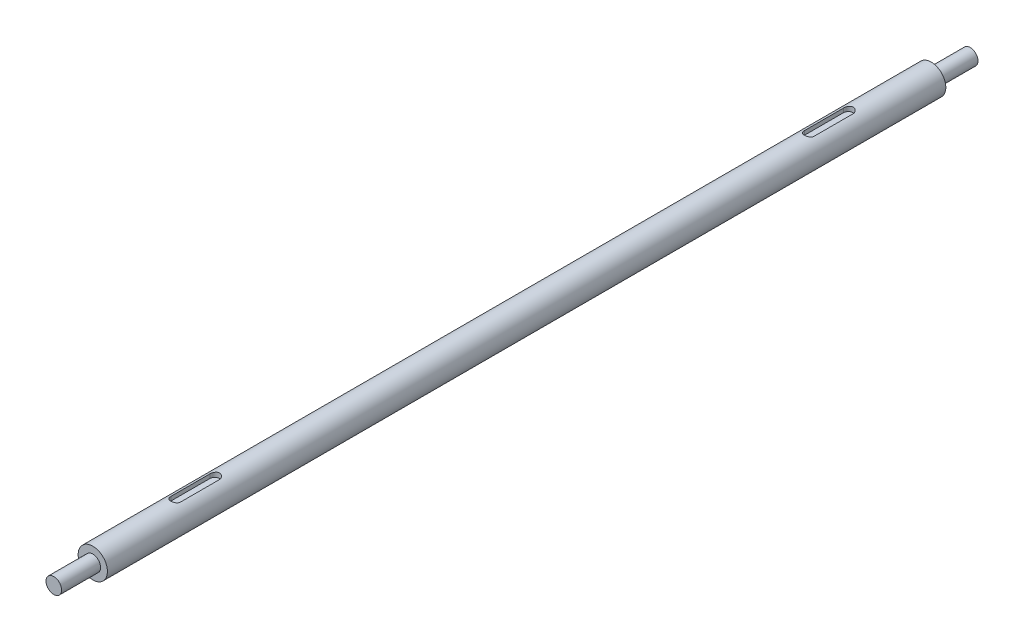
ISO-10303-21;
HEADER;
FILE_DESCRIPTION(('STEP AP214'),'2;1');
FILE_NAME('part.step','',(''),(''),'','','');
FILE_SCHEMA(('AUTOMOTIVE_DESIGN { 1 0 10303 214 1 1 1 1 }'));
ENDSEC;
DATA;
#1=APPLICATION_CONTEXT('core data for automotive mechanical design processes');
#2=APPLICATION_PROTOCOL_DEFINITION('international standard','automotive_design',2000,#1);
#3=PRODUCT_CONTEXT('',#1,'mechanical');
#4=PRODUCT('Part','Part','',(#3));
#5=PRODUCT_RELATED_PRODUCT_CATEGORY('part','',(#4));
#6=PRODUCT_DEFINITION_FORMATION('','',#4);
#7=PRODUCT_DEFINITION_CONTEXT('part definition',#1,'design');
#8=PRODUCT_DEFINITION('design','',#6,#7);
#9=PRODUCT_DEFINITION_SHAPE('','',#8);
#10=(LENGTH_UNIT() NAMED_UNIT(*) SI_UNIT(.MILLI.,.METRE.));
#11=(NAMED_UNIT(*) PLANE_ANGLE_UNIT() SI_UNIT($,.RADIAN.));
#12=(NAMED_UNIT(*) SI_UNIT($,.STERADIAN.) SOLID_ANGLE_UNIT());
#13=UNCERTAINTY_MEASURE_WITH_UNIT(LENGTH_MEASURE(1.E-05),#10,'distance_accuracy_value','');
#14=(GEOMETRIC_REPRESENTATION_CONTEXT(3) GLOBAL_UNCERTAINTY_ASSIGNED_CONTEXT((#13)) GLOBAL_UNIT_ASSIGNED_CONTEXT((#10,
#11,#12)) REPRESENTATION_CONTEXT('',''));
#15=CARTESIAN_POINT('',(0.,0.,0.));
#16=DIRECTION('',(0.,0.,1.));
#17=DIRECTION('',(1.,0.,0.));
#18=AXIS2_PLACEMENT_3D('',#15,#16,#17);
#19=CARTESIAN_POINT('',(0.,0.,215.));
#20=DIRECTION('',(0.,0.,-1.));
#21=DIRECTION('',(-1.,0.,0.));
#22=AXIS2_PLACEMENT_3D('',#19,#20,#21);
#23=CYLINDRICAL_SURFACE('',#22,7.5);
#24=CARTESIAN_POINT('',(0.,7.5,175.));
#25=CARTESIAN_POINT('',(-0.136408407216812,7.5000003825236,175.000000634329));
#26=CARTESIAN_POINT('',(-0.272812986346386,7.49624423768862,174.988799334682));
#27=CARTESIAN_POINT('',(-0.541604402182454,7.48163025508202,174.944427227957));
#28=CARTESIAN_POINT('',(-0.673990820297073,7.47077168005381,174.911254140128));
#29=CARTESIAN_POINT('',(-0.930831973754484,7.44313269766106,174.82420189154));
#30=CARTESIAN_POINT('',(-1.05529956471514,7.42636219327133,174.770357343852));
#31=CARTESIAN_POINT('',(-1.29343734201338,7.38861114293353,174.643647067904));
#32=CARTESIAN_POINT('',(-1.40710539239683,7.36762976669444,174.570777587494));
#33=CARTESIAN_POINT('',(-1.62435418755574,7.32285236107511,174.405435487853));
#34=CARTESIAN_POINT('',(-1.72750925074585,7.2989889115946,174.312421914349));
#35=CARTESIAN_POINT('',(-1.91708173175529,7.25150786957801,174.110582113234));
#36=CARTESIAN_POINT('',(-2.00349546372375,7.2278903322637,174.001752412679));
#37=CARTESIAN_POINT('',(-2.15956235556975,7.18283331193181,173.767537212009));
#38=CARTESIAN_POINT('',(-2.22866214555269,7.16147598189217,173.64176565067));
#39=CARTESIAN_POINT('',(-2.34454718469442,7.12438263546499,173.379559763854));
#40=CARTESIAN_POINT('',(-2.39133924346703,7.1086449040186,173.243128707093));
#41=CARTESIAN_POINT('',(-2.45968365377302,7.08528258173439,172.968316946258));
#42=CARTESIAN_POINT('',(-2.48203362067954,7.07740239424024,172.830156978777));
#43=CARTESIAN_POINT('',(-2.50335280833631,7.06989141573764,172.55184061461));
#44=CARTESIAN_POINT('',(-2.50232925401192,7.07025807556821,172.411684848227));
#45=CARTESIAN_POINT('',(-2.47754975925867,7.07897537520446,172.14015842389));
#46=CARTESIAN_POINT('',(-2.45483478291761,7.08696039668828,172.008678992702));
#47=CARTESIAN_POINT('',(-2.38901540712366,7.10941644311373,171.751516450983));
#48=CARTESIAN_POINT('',(-2.3459085664798,7.12388824460265,171.625834036412));
#49=CARTESIAN_POINT('',(-2.23984764515065,7.15794777828118,171.381468126021));
#50=CARTESIAN_POINT('',(-2.17658512176828,7.1776141448279,171.262929936326));
#51=CARTESIAN_POINT('',(-2.03222276575796,7.21981396439313,171.037822729301));
#52=CARTESIAN_POINT('',(-1.95111778091011,7.24234824476156,170.931257182666));
#53=CARTESIAN_POINT('',(-1.76837333170567,7.2891832291935,170.727271004598));
#54=CARTESIAN_POINT('',(-1.66588287519084,7.31351473387106,170.630618263727));
#55=CARTESIAN_POINT('',(-1.44584892492522,7.3601734596759,170.455671833341));
#56=CARTESIAN_POINT('',(-1.3283039891521,7.38250048845167,170.377379904589));
#57=CARTESIAN_POINT('',(-1.07986903261574,7.42292769844483,170.240759249412));
#58=CARTESIAN_POINT('',(-0.948858191040902,7.44098375020097,170.182636271648));
#59=CARTESIAN_POINT('',(-0.678172708411314,7.47051417861087,170.089492065111));
#60=CARTESIAN_POINT('',(-0.538501095387421,7.48199084137198,170.054462811441));
#61=CARTESIAN_POINT('',(-0.260959573823281,7.49669067678601,170.009860834944));
#62=CARTESIAN_POINT('',(-0.123273999662129,7.5002500458432,169.999250477068));
#63=CARTESIAN_POINT('',(0.151937674900593,7.49972256737068,170.000831683996));
#64=CARTESIAN_POINT('',(0.289463798299131,7.49563701048406,170.01301939995));
#65=CARTESIAN_POINT('',(0.556299665760658,7.4805006179276,170.05902976934));
#66=CARTESIAN_POINT('',(0.685732017087136,7.4696549677798,170.092215515124));
#67=CARTESIAN_POINT('',(0.937139896448973,7.44229617075174,170.178483611167));
#68=CARTESIAN_POINT('',(1.05911447127156,7.42578230116687,170.231568498669));
#69=CARTESIAN_POINT('',(1.29572074098324,7.38822328218223,170.357676079602));
#70=CARTESIAN_POINT('',(1.41007489804293,7.36707036889464,170.431186483208));
#71=CARTESIAN_POINT('',(1.62516207533905,7.32263134790654,170.595485375034));
#72=CARTESIAN_POINT('',(1.72589091948903,7.29934458984567,170.686279140079));
#73=CARTESIAN_POINT('',(1.91563126951584,7.25192119951109,170.887446877516));
#74=CARTESIAN_POINT('',(2.00390242311451,7.22779402718567,170.998523067317));
#75=CARTESIAN_POINT('',(2.16064380580903,7.18249933236769,171.234428919527));
#76=CARTESIAN_POINT('',(2.22911386982764,7.16133183455003,171.359258696585));
#77=CARTESIAN_POINT('',(2.34399232604102,7.12455979478455,171.619182538225));
#78=CARTESIAN_POINT('',(2.39044533041267,7.10894401982443,171.754255197922));
#79=CARTESIAN_POINT('',(2.45973666689851,7.0852708076612,172.03094662511));
#80=CARTESIAN_POINT('',(2.48258563738497,7.07720996559094,172.172562413511));
#81=CARTESIAN_POINT('',(2.50319070619348,7.06994647185438,172.450492740102));
#82=CARTESIAN_POINT('',(2.50217564327112,7.07031000643533,172.586705850717));
#83=CARTESIAN_POINT('',(2.47810573362186,7.07878174559664,172.856912687305));
#84=CARTESIAN_POINT('',(2.45505219864659,7.08688948923399,172.990906544888));
#85=CARTESIAN_POINT('',(2.38842953282349,7.10961310762225,173.250339157506));
#86=CARTESIAN_POINT('',(2.34525836503891,7.1241024505619,173.375892062511));
#87=CARTESIAN_POINT('',(2.23994841439949,7.15790997046167,173.618068517346));
#88=CARTESIAN_POINT('',(2.17780542138464,7.17722921908479,173.73469007797));
#89=CARTESIAN_POINT('',(2.03315173145869,7.21957073065112,173.961209174807));
#90=CARTESIAN_POINT('',(1.94987060691156,7.2427177910534,174.070591254746));
#91=CARTESIAN_POINT('',(1.76660720783922,7.2895839070813,174.274224533461));
#92=CARTESIAN_POINT('',(1.66662021112881,7.31330312280928,174.36847143922));
#93=CARTESIAN_POINT('',(1.44810389230182,7.35975076313858,174.542861030723));
#94=CARTESIAN_POINT('',(1.32900378374942,7.3824045450314,174.622310869378));
#95=CARTESIAN_POINT('',(1.07839339351665,7.42314977931529,174.759976072127));
#96=CARTESIAN_POINT('',(0.946886295330949,7.44124239769824,174.818196864805));
#97=CARTESIAN_POINT('',(0.681234118002497,7.47013787671354,174.909304081222));
#98=CARTESIAN_POINT('',(0.547469394191067,7.48123031056306,174.943206165659));
#99=CARTESIAN_POINT('',(0.275801040025641,7.49616017660554,174.988550701693));
#100=CARTESIAN_POINT('',(0.137898563921879,7.49999961329762,174.999999358741));
#101=CARTESIAN_POINT('',(0.,7.5,175.));
#102=B_SPLINE_CURVE_WITH_KNOTS('',3,(#24,#25,#26,#27,#28,#29,#30,#31,#32,#33,#34,#35,#36,#37,
#38,#39,#40,#41,#42,#43,#44,#45,#46,#47,#48,#49,#50,#51,#52,#53,#54,#55,#56,#57,#58,#59,#60,#61,
#62,#63,#64,#65,#66,#67,#68,#69,#70,#71,#72,#73,#74,#75,#76,#77,#78,#79,#80,#81,#82,#83,#84,#85,
#86,#87,#88,#89,#90,#91,#92,#93,#94,#95,#96,#97,#98,#99,#100,#101),.UNSPECIFIED.,.T.,.F.,(4,2,2,
2,2,2,2,2,2,2,2,2,2,2,2,2,2,2,2,2,2,2,2,2,2,2,2,2,2,2,2,2,2,2,2,2,2,2,4),(0.,0.408717765065047,
0.817477963168841,1.22555668217575,1.63371594449783,2.05461710706899,2.47561083218837,
2.9087096205869,3.34167611732099,3.7600481435462,4.17829084968734,4.5774206637822,
4.97659827138725,5.3822042788785,5.78792756395545,6.21483264528451,6.64177864916577,
7.07296014125927,7.50399172193057,7.91633957937962,8.32861782910482,8.72895394945576,
9.12934113210304,9.54025999609389,9.95130452054775,10.3810255720193,10.8107502058754,
11.2396003456698,11.6682571176466,12.074891651607,12.481501983785,12.8803896770111,
13.2793659544001,13.6957516672958,14.1122552780951,14.5449915208782,14.9776170288121,
15.3909139593461,15.8040966509543),.UNSPECIFIED.);
#103=CARTESIAN_POINT('',(2.50000000000013,7.07106781186543,172.5));
#104=VERTEX_POINT('',#103);
#105=CARTESIAN_POINT('',(-2.50000000000012,7.07106781186534,172.5));
#106=VERTEX_POINT('',#105);
#107=EDGE_CURVE('E210',#104,#106,#102,.T.);
#108=ORIENTED_EDGE('',*,*,#107,.T.);
#109=DIRECTION('',(0.,0.,-1.));
#110=VECTOR('',#109,1.);
#111=CARTESIAN_POINT('',(-2.50000000000037,7.07106781186534,215.));
#112=LINE('',#111,#110);
#113=CARTESIAN_POINT('',(-2.5,7.07106781186548,152.5));
#114=VERTEX_POINT('',#113);
#115=EDGE_CURVE('E41',#106,#114,#112,.T.);
#116=ORIENTED_EDGE('',*,*,#115,.T.);
#117=CARTESIAN_POINT('',(0.,7.5,155.));
#118=CARTESIAN_POINT('',(-0.136408407216806,7.5000003825236,155.000000634329));
#119=CARTESIAN_POINT('',(-0.272812986346373,7.49624423768862,154.988799334682));
#120=CARTESIAN_POINT('',(-0.541604402182429,7.48163025508202,154.944427227957));
#121=CARTESIAN_POINT('',(-0.673990820297043,7.47077168005381,154.911254140128));
#122=CARTESIAN_POINT('',(-0.930831973754441,7.44313269766107,154.82420189154));
#123=CARTESIAN_POINT('',(-1.05529956471509,7.42636219327133,154.770357343852));
#124=CARTESIAN_POINT('',(-1.29343734201331,7.38861114293354,154.643647067904));
#125=CARTESIAN_POINT('',(-1.40710539239676,7.36762976669445,154.570777587493));
#126=CARTESIAN_POINT('',(-1.62435418755566,7.32285236107513,154.405435487853));
#127=CARTESIAN_POINT('',(-1.72750925074578,7.29898891159462,154.312421914349));
#128=CARTESIAN_POINT('',(-1.91708173175521,7.25150786957803,154.110582113234));
#129=CARTESIAN_POINT('',(-2.00349546372365,7.22789033226373,154.001752412679));
#130=CARTESIAN_POINT('',(-2.15956235556965,7.18283331193184,153.767537212009));
#131=CARTESIAN_POINT('',(-2.22866214555258,7.1614759818922,153.64176565067));
#132=CARTESIAN_POINT('',(-2.34454718469431,7.12438263546503,153.379559763854));
#133=CARTESIAN_POINT('',(-2.39133924346691,7.10864490401864,153.243128707093));
#134=CARTESIAN_POINT('',(-2.45968365377291,7.08528258173443,152.968316946258));
#135=CARTESIAN_POINT('',(-2.48203362067942,7.07740239424028,152.830156978777));
#136=CARTESIAN_POINT('',(-2.50335280833619,7.06989141573769,152.55184061461));
#137=CARTESIAN_POINT('',(-2.5023292540118,7.07025807556825,152.411684848227));
#138=CARTESIAN_POINT('',(-2.47754975925855,7.0789753752045,152.14015842389));
#139=CARTESIAN_POINT('',(-2.45483478291749,7.08696039668832,152.008678992702));
#140=CARTESIAN_POINT('',(-2.38901540712355,7.10941644311377,151.751516450983));
#141=CARTESIAN_POINT('',(-2.34590856647968,7.12388824460269,151.625834036412));
#142=CARTESIAN_POINT('',(-2.23984764515053,7.15794777828122,151.381468126021));
#143=CARTESIAN_POINT('',(-2.17658512176817,7.17761414482793,151.262929936326));
#144=CARTESIAN_POINT('',(-2.03222276575786,7.21981396439315,151.037822729301));
#145=CARTESIAN_POINT('',(-1.95111778091002,7.24234824476159,150.931257182667));
#146=CARTESIAN_POINT('',(-1.7683733317056,7.28918322919352,150.727271004598));
#147=CARTESIAN_POINT('',(-1.66588287519079,7.31351473387107,150.630618263727));
#148=CARTESIAN_POINT('',(-1.44584892492516,7.36017345967592,150.455671833341));
#149=CARTESIAN_POINT('',(-1.32830398915203,7.38250048845169,150.377379904589));
#150=CARTESIAN_POINT('',(-1.07986903261566,7.42292769844484,150.240759249412));
#151=CARTESIAN_POINT('',(-0.948858191040834,7.44098375020098,150.182636271648));
#152=CARTESIAN_POINT('',(-0.678172708411264,7.47051417861087,150.089492065111));
#153=CARTESIAN_POINT('',(-0.538501095387377,7.48199084137198,150.054462811441));
#154=CARTESIAN_POINT('',(-0.260959573823253,7.49669067678601,150.009860834944));
#155=CARTESIAN_POINT('',(-0.12327399966211,7.5002500458432,149.999250477068));
#156=CARTESIAN_POINT('',(0.151937674900596,7.49972256737068,150.000831683996));
#157=CARTESIAN_POINT('',(0.289463798299128,7.49563701048406,150.01301939995));
#158=CARTESIAN_POINT('',(0.556299665760639,7.48050061792761,150.05902976934));
#159=CARTESIAN_POINT('',(0.685732017087108,7.46965496777981,150.092215515124));
#160=CARTESIAN_POINT('',(0.937139896448932,7.44229617075175,150.178483611167));
#161=CARTESIAN_POINT('',(1.05911447127151,7.42578230116688,150.231568498669));
#162=CARTESIAN_POINT('',(1.29572074098318,7.38822328218224,150.357676079602));
#163=CARTESIAN_POINT('',(1.41007489804287,7.36707036889465,150.431186483208));
#164=CARTESIAN_POINT('',(1.62516207533897,7.32263134790656,150.595485375034));
#165=CARTESIAN_POINT('',(1.72589091948894,7.29934458984569,150.686279140079));
#166=CARTESIAN_POINT('',(1.91563126951575,7.25192119951112,150.887446877516));
#167=CARTESIAN_POINT('',(2.00390242311443,7.2277940271857,150.998523067317));
#168=CARTESIAN_POINT('',(2.16064380580894,7.18249933236772,151.234428919527));
#169=CARTESIAN_POINT('',(2.22911386982753,7.16133183455006,151.359258696585));
#170=CARTESIAN_POINT('',(2.34399232604091,7.12455979478459,151.619182538225));
#171=CARTESIAN_POINT('',(2.39044533041255,7.10894401982447,151.754255197922));
#172=CARTESIAN_POINT('',(2.45973666689839,7.08527080766124,152.03094662511));
#173=CARTESIAN_POINT('',(2.48258563738485,7.07720996559098,152.172562413511));
#174=CARTESIAN_POINT('',(2.50319070619336,7.06994647185443,152.450492740102));
#175=CARTESIAN_POINT('',(2.502175643271,7.07031000643538,152.586705850717));
#176=CARTESIAN_POINT('',(2.47810573362173,7.07878174559668,152.856912687305));
#177=CARTESIAN_POINT('',(2.45505219864647,7.08688948923404,152.990906544888));
#178=CARTESIAN_POINT('',(2.38842953282336,7.10961310762229,153.250339157506));
#179=CARTESIAN_POINT('',(2.34525836503878,7.12410245056194,153.375892062511));
#180=CARTESIAN_POINT('',(2.23994841439936,7.15790997046172,153.618068517346));
#181=CARTESIAN_POINT('',(2.17780542138451,7.17722921908483,153.73469007797));
#182=CARTESIAN_POINT('',(2.03315173145857,7.21957073065116,153.961209174807));
#183=CARTESIAN_POINT('',(1.94987060691144,7.24271779105343,154.070591254746));
#184=CARTESIAN_POINT('',(1.76660720783912,7.28958390708132,154.274224533461));
#185=CARTESIAN_POINT('',(1.66662021112871,7.31330312280931,154.36847143922));
#186=CARTESIAN_POINT('',(1.44810389230173,7.3597507631386,154.542861030723));
#187=CARTESIAN_POINT('',(1.32900378374934,7.38240454503141,154.622310869377));
#188=CARTESIAN_POINT('',(1.07839339351657,7.4231497793153,154.759976072127));
#189=CARTESIAN_POINT('',(0.946886295330882,7.44124239769824,154.818196864805));
#190=CARTESIAN_POINT('',(0.681234118002448,7.47013787671354,154.909304081222));
#191=CARTESIAN_POINT('',(0.54746939419103,7.48123031056307,154.943206165658));
#192=CARTESIAN_POINT('',(0.275801040025624,7.49616017660554,154.988550701693));
#193=CARTESIAN_POINT('',(0.13789856392187,7.49999961329762,154.999999358741));
#194=CARTESIAN_POINT('',(0.,7.5,155.));
#195=B_SPLINE_CURVE_WITH_KNOTS('',3,(#117,#118,#119,#120,#121,#122,#123,#124,#125,#126,#127,
#128,#129,#130,#131,#132,#133,#134,#135,#136,#137,#138,#139,#140,#141,#142,#143,#144,#145,#146,
#147,#148,#149,#150,#151,#152,#153,#154,#155,#156,#157,#158,#159,#160,#161,#162,#163,#164,#165,
#166,#167,#168,#169,#170,#171,#172,#173,#174,#175,#176,#177,#178,#179,#180,#181,#182,#183,#184,
#185,#186,#187,#188,#189,#190,#191,#192,#193,#194),.UNSPECIFIED.,.T.,.F.,(4,2,2,2,2,2,2,2,2,2,2,
2,2,2,2,2,2,2,2,2,2,2,2,2,2,2,2,2,2,2,2,2,2,2,2,2,2,2,4),(0.,0.408717765065026,
0.817477963168804,1.2255566821757,1.63371594449774,2.0546171070689,2.47561083218827,
2.90870962058677,3.34167611732083,3.76004814354601,4.17829084968712,4.57742066378198,
4.97659827138703,5.38220427887824,5.78792756395517,6.21483264528418,6.64177864916547,
7.07296014125895,7.50399172193021,7.91633957937925,8.32861782910441,8.72895394945534,
9.1293411321026,9.54025999609341,9.95130452054726,10.3810255720188,10.8107502058749,
11.2396003456693,11.668257117646,12.0748916516065,12.4815019837844,12.8803896770105,
13.2793659543995,13.6957516672951,14.1122552780945,14.5449915208775,14.9776170288114,
15.3909139593453,15.8040966509535),.UNSPECIFIED.);
#196=CARTESIAN_POINT('',(2.5,7.07106781186534,152.5));
#197=VERTEX_POINT('',#196);
#198=EDGE_CURVE('E53',#114,#197,#195,.T.);
#199=ORIENTED_EDGE('',*,*,#198,.T.);
#200=DIRECTION('',(0.,0.,-1.));
#201=VECTOR('',#200,1.);
#202=CARTESIAN_POINT('',(2.50000000000039,7.07106781186534,215.));
#203=LINE('',#202,#201);
#204=EDGE_CURVE('E233',#197,#104,#203,.F.);
#205=ORIENTED_EDGE('',*,*,#204,.T.);
#206=EDGE_LOOP('',(#108,#116,#199,#205));
#207=FACE_BOUND('',#206,.T.);
#208=CARTESIAN_POINT('',(0.,7.5,-150.));
#209=CARTESIAN_POINT('',(-0.136408407216843,7.5000003825236,-149.999999365671));
#210=CARTESIAN_POINT('',(-0.27281298634641,7.49624423768862,-150.011200665318));
#211=CARTESIAN_POINT('',(-0.541604402182467,7.48163025508202,-150.055572772043));
#212=CARTESIAN_POINT('',(-0.673990820297081,7.47077168005381,-150.088745859872));
#213=CARTESIAN_POINT('',(-0.930831973754479,7.44313269766106,-150.17579810846));
#214=CARTESIAN_POINT('',(-1.05529956471513,7.42636219327133,-150.229642656148));
#215=CARTESIAN_POINT('',(-1.29343734201335,7.38861114293354,-150.356352932096));
#216=CARTESIAN_POINT('',(-1.4071053923968,7.36762976669444,-150.429222412507));
#217=CARTESIAN_POINT('',(-1.6243541875557,7.32285236107512,-150.594564512147));
#218=CARTESIAN_POINT('',(-1.72750925074581,7.29898891159461,-150.687578085651));
#219=CARTESIAN_POINT('',(-1.91708173175525,7.25150786957802,-150.889417886766));
#220=CARTESIAN_POINT('',(-2.00349546372369,7.22789033226372,-150.998247587321));
#221=CARTESIAN_POINT('',(-2.15956235556967,7.18283331193183,-151.232462787991));
#222=CARTESIAN_POINT('',(-2.2286621455526,7.1614759818922,-151.35823434933));
#223=CARTESIAN_POINT('',(-2.34454718469433,7.12438263546502,-151.620440236146));
#224=CARTESIAN_POINT('',(-2.39133924346694,7.10864490401863,-151.756871292907));
#225=CARTESIAN_POINT('',(-2.45968365377294,7.08528258173442,-152.031683053742));
#226=CARTESIAN_POINT('',(-2.48203362067946,7.07740239424027,-152.169843021223));
#227=CARTESIAN_POINT('',(-2.50335280833623,7.06989141573767,-152.44815938539));
#228=CARTESIAN_POINT('',(-2.50232925401183,7.07025807556824,-152.588315151773));
#229=CARTESIAN_POINT('',(-2.47754975925859,7.07897537520449,-152.85984157611));
#230=CARTESIAN_POINT('',(-2.45483478291753,7.08696039668831,-152.991321007298));
#231=CARTESIAN_POINT('',(-2.38901540712359,7.10941644311376,-153.248483549017));
#232=CARTESIAN_POINT('',(-2.34590856647972,7.12388824460268,-153.374165963588));
#233=CARTESIAN_POINT('',(-2.23984764515057,7.15794777828121,-153.618531873979));
#234=CARTESIAN_POINT('',(-2.17658512176821,7.17761414482792,-153.737070063674));
#235=CARTESIAN_POINT('',(-2.0322227657579,7.21981396439315,-153.962177270699));
#236=CARTESIAN_POINT('',(-1.95111778091006,7.24234824476158,-154.068742817333));
#237=CARTESIAN_POINT('',(-1.76837333170563,7.28918322919351,-154.272728995402));
#238=CARTESIAN_POINT('',(-1.66588287519082,7.31351473387106,-154.369381736273));
#239=CARTESIAN_POINT('',(-1.4458489249252,7.36017345967591,-154.544328166658));
#240=CARTESIAN_POINT('',(-1.32830398915207,7.38250048845168,-154.622620095411));
#241=CARTESIAN_POINT('',(-1.07986903261569,7.42292769844484,-154.759240750588));
#242=CARTESIAN_POINT('',(-0.948858191040872,7.44098375020098,-154.817363728352));
#243=CARTESIAN_POINT('',(-0.678172708411302,7.47051417861087,-154.910507934889));
#244=CARTESIAN_POINT('',(-0.538501095387415,7.48199084137198,-154.945537188559));
#245=CARTESIAN_POINT('',(-0.260959573823291,7.49669067678601,-154.990139165056));
#246=CARTESIAN_POINT('',(-0.123273999662148,7.5002500458432,-155.000749522932));
#247=CARTESIAN_POINT('',(0.151937674900559,7.49972256737069,-154.999168316004));
#248=CARTESIAN_POINT('',(0.289463798299091,7.49563701048406,-154.98698060005));
#249=CARTESIAN_POINT('',(0.556299665760603,7.48050061792761,-154.94097023066));
#250=CARTESIAN_POINT('',(0.685732017087072,7.46965496777981,-154.907784484876));
#251=CARTESIAN_POINT('',(0.937139896448896,7.44229617075175,-154.821516388833));
#252=CARTESIAN_POINT('',(1.05911447127148,7.42578230116688,-154.768431501331));
#253=CARTESIAN_POINT('',(1.29572074098314,7.38822328218225,-154.642323920398));
#254=CARTESIAN_POINT('',(1.41007489804283,7.36707036889466,-154.568813516792));
#255=CARTESIAN_POINT('',(1.62516207533893,7.32263134790657,-154.404514624966));
#256=CARTESIAN_POINT('',(1.7258909194889,7.2993445898457,-154.313720859921));
#257=CARTESIAN_POINT('',(1.91563126951571,7.25192119951113,-154.112553122484));
#258=CARTESIAN_POINT('',(2.00390242311439,7.22779402718571,-154.001476932683));
#259=CARTESIAN_POINT('',(2.1606438058089,7.18249933236773,-153.765571080473));
#260=CARTESIAN_POINT('',(2.2291138698275,7.16133183455007,-153.640741303415));
#261=CARTESIAN_POINT('',(2.34399232604087,7.1245597947846,-153.380817461775));
#262=CARTESIAN_POINT('',(2.39044533041252,7.10894401982448,-153.245744802078));
#263=CARTESIAN_POINT('',(2.45973666689836,7.08527080766125,-152.96905337489));
#264=CARTESIAN_POINT('',(2.48258563738482,7.077209965591,-152.827437586489));
#265=CARTESIAN_POINT('',(2.50319070619332,7.06994647185444,-152.549507259898));
#266=CARTESIAN_POINT('',(2.50217564327096,7.07031000643539,-152.413294149283));
#267=CARTESIAN_POINT('',(2.4781057336217,7.0787817455967,-152.143087312695));
#268=CARTESIAN_POINT('',(2.45505219864643,7.08688948923405,-152.009093455112));
#269=CARTESIAN_POINT('',(2.38842953282333,7.1096131076223,-151.749660842494));
#270=CARTESIAN_POINT('',(2.34525836503874,7.12410245056195,-151.624107937489));
#271=CARTESIAN_POINT('',(2.23994841439932,7.15790997046173,-151.381931482654));
#272=CARTESIAN_POINT('',(2.17780542138447,7.17722921908484,-151.26530992203));
#273=CARTESIAN_POINT('',(2.03315173145853,7.21957073065117,-151.038790825193));
#274=CARTESIAN_POINT('',(1.9498706069114,7.24271779105344,-150.929408745254));
#275=CARTESIAN_POINT('',(1.76660720783908,7.28958390708133,-150.725775466539));
#276=CARTESIAN_POINT('',(1.66662021112867,7.31330312280931,-150.63152856078));
#277=CARTESIAN_POINT('',(1.44810389230169,7.35975076313861,-150.457138969277));
#278=CARTESIAN_POINT('',(1.32900378374929,7.38240454503142,-150.377689130622));
#279=CARTESIAN_POINT('',(1.07839339351652,7.42314977931531,-150.240023927873));
#280=CARTESIAN_POINT('',(0.946886295330828,7.44124239769825,-150.181803135195));
#281=CARTESIAN_POINT('',(0.681234118002392,7.47013787671355,-150.090695918778));
#282=CARTESIAN_POINT('',(0.547469394190976,7.48123031056307,-150.056793834342));
#283=CARTESIAN_POINT('',(0.275801040025577,7.49616017660555,-150.011449298307));
#284=CARTESIAN_POINT('',(0.137898563921828,7.49999961329762,-150.000000641259));
#285=CARTESIAN_POINT('',(0.,7.5,-150.));
#286=B_SPLINE_CURVE_WITH_KNOTS('',3,(#208,#209,#210,#211,#212,#213,#214,#215,#216,#217,#218,
#219,#220,#221,#222,#223,#224,#225,#226,#227,#228,#229,#230,#231,#232,#233,#234,#235,#236,#237,
#238,#239,#240,#241,#242,#243,#244,#245,#246,#247,#248,#249,#250,#251,#252,#253,#254,#255,#256,
#257,#258,#259,#260,#261,#262,#263,#264,#265,#266,#267,#268,#269,#270,#271,#272,#273,#274,#275,
#276,#277,#278,#279,#280,#281,#282,#283,#284,#285),.UNSPECIFIED.,.T.,.F.,(4,2,2,2,2,2,2,2,2,2,2,
2,2,2,2,2,2,2,2,2,2,2,2,2,2,2,2,2,2,2,2,2,2,2,2,2,2,2,4),(0.,0.408717765065027,
0.817477963168804,1.2255566821757,1.63371594449774,2.0546171070689,2.47561083218827,
2.90870962058673,3.34167611732083,3.76004814354601,4.17829084968712,4.57742066378198,
4.97659827138703,5.38220427887825,5.78792756395517,6.21483264528418,6.64177864916547,
7.07296014125895,7.50399172193021,7.91633957937925,8.32861782910441,8.72895394945534,
9.1293411321026,9.54025999609341,9.95130452054726,10.3810255720188,10.8107502058749,
11.2396003456693,11.668257117646,12.0748916516065,12.4815019837844,12.8803896770105,
13.2793659543995,13.6957516672951,14.1122552780945,14.5449915208775,14.9776170288114,
15.3909139593454,15.8040966509535),.UNSPECIFIED.);
#287=CARTESIAN_POINT('',(2.50000000000071,7.07106781186532,-152.499999999999));
#288=VERTEX_POINT('',#287);
#289=CARTESIAN_POINT('',(-2.50000000000004,7.07106781186626,-152.5));
#290=VERTEX_POINT('',#289);
#291=EDGE_CURVE('E172',#288,#290,#286,.T.);
#292=ORIENTED_EDGE('',*,*,#291,.T.);
#293=DIRECTION('',(0.,0.,-1.));
#294=VECTOR('',#293,1.);
#295=CARTESIAN_POINT('',(-2.49999999999778,7.07106781186626,215.));
#296=LINE('',#295,#294);
#297=CARTESIAN_POINT('',(-2.50000000000016,7.07106781186542,-172.5));
#298=VERTEX_POINT('',#297);
#299=EDGE_CURVE('E219',#290,#298,#296,.T.);
#300=ORIENTED_EDGE('',*,*,#299,.T.);
#301=CARTESIAN_POINT('',(0.,7.5,-170.));
#302=CARTESIAN_POINT('',(-0.136408407216855,7.5000003825236,-169.999999365671));
#303=CARTESIAN_POINT('',(-0.272812986346428,7.49624423768862,-170.011200665318));
#304=CARTESIAN_POINT('',(-0.541604402182497,7.48163025508201,-170.055572772043));
#305=CARTESIAN_POINT('',(-0.673990820297116,7.47077168005381,-170.088745859872));
#306=CARTESIAN_POINT('',(-0.930831973754527,7.44313269766105,-170.17579810846));
#307=CARTESIAN_POINT('',(-1.05529956471518,7.42636219327132,-170.229642656148));
#308=CARTESIAN_POINT('',(-1.29343734201342,7.38861114293353,-170.356352932096));
#309=CARTESIAN_POINT('',(-1.40710539239688,7.36762976669443,-170.429222412506));
#310=CARTESIAN_POINT('',(-1.62435418755578,7.3228523610751,-170.594564512147));
#311=CARTESIAN_POINT('',(-1.72750925074589,7.29898891159459,-170.687578085651));
#312=CARTESIAN_POINT('',(-1.91708173175534,7.251507869578,-170.889417886766));
#313=CARTESIAN_POINT('',(-2.00349546372379,7.22789033226369,-170.998247587321));
#314=CARTESIAN_POINT('',(-2.15956235556979,7.1828333119318,-171.232462787991));
#315=CARTESIAN_POINT('',(-2.22866214555273,7.16147598189216,-171.35823434933));
#316=CARTESIAN_POINT('',(-2.34454718469446,7.12438263546498,-171.620440236146));
#317=CARTESIAN_POINT('',(-2.39133924346707,7.10864490401859,-171.756871292907));
#318=CARTESIAN_POINT('',(-2.45968365377307,7.08528258173438,-172.031683053742));
#319=CARTESIAN_POINT('',(-2.48203362067958,7.07740239424022,-172.169843021223));
#320=CARTESIAN_POINT('',(-2.50335280833635,7.06989141573763,-172.44815938539));
#321=CARTESIAN_POINT('',(-2.50232925401196,7.07025807556819,-172.588315151773));
#322=CARTESIAN_POINT('',(-2.47754975925871,7.07897537520445,-172.85984157611));
#323=CARTESIAN_POINT('',(-2.45483478291765,7.08696039668827,-172.991321007298));
#324=CARTESIAN_POINT('',(-2.3890154071237,7.10941644311372,-173.248483549017));
#325=CARTESIAN_POINT('',(-2.34590856647984,7.12388824460264,-173.374165963588));
#326=CARTESIAN_POINT('',(-2.23984764515069,7.15794777828117,-173.618531873979));
#327=CARTESIAN_POINT('',(-2.17658512176831,7.17761414482789,-173.737070063674));
#328=CARTESIAN_POINT('',(-2.03222276575799,7.21981396439312,-173.962177270699));
#329=CARTESIAN_POINT('',(-1.95111778091015,7.24234824476155,-174.068742817334));
#330=CARTESIAN_POINT('',(-1.76837333170572,7.28918322919349,-174.272728995402));
#331=CARTESIAN_POINT('',(-1.6658828751909,7.31351473387104,-174.369381736273));
#332=CARTESIAN_POINT('',(-1.44584892492528,7.3601734596759,-174.544328166659));
#333=CARTESIAN_POINT('',(-1.32830398915215,7.38250048845166,-174.622620095411));
#334=CARTESIAN_POINT('',(-1.07986903261578,7.42292769844482,-174.759240750588));
#335=CARTESIAN_POINT('',(-0.948858191040944,7.44098375020097,-174.817363728352));
#336=CARTESIAN_POINT('',(-0.678172708411355,7.47051417861086,-174.910507934889));
#337=CARTESIAN_POINT('',(-0.538501095387462,7.48199084137197,-174.945537188559));
#338=CARTESIAN_POINT('',(-0.260959573823323,7.49669067678601,-174.990139165056));
#339=CARTESIAN_POINT('',(-0.123273999662171,7.5002500458432,-175.000749522932));
#340=CARTESIAN_POINT('',(0.151937674900552,7.49972256737069,-174.999168316004));
#341=CARTESIAN_POINT('',(0.289463798299092,7.49563701048406,-174.98698060005));
#342=CARTESIAN_POINT('',(0.556299665760618,7.48050061792761,-174.94097023066));
#343=CARTESIAN_POINT('',(0.685732017087093,7.46965496777981,-174.907784484876));
#344=CARTESIAN_POINT('',(0.937139896448929,7.44229617075175,-174.821516388833));
#345=CARTESIAN_POINT('',(1.05911447127152,7.42578230116688,-174.768431501331));
#346=CARTESIAN_POINT('',(1.29572074098319,7.38822328218224,-174.642323920398));
#347=CARTESIAN_POINT('',(1.41007489804288,7.36707036889465,-174.568813516792));
#348=CARTESIAN_POINT('',(1.625162075339,7.32263134790655,-174.404514624966));
#349=CARTESIAN_POINT('',(1.72589091948898,7.29934458984568,-174.313720859921));
#350=CARTESIAN_POINT('',(1.91563126951579,7.25192119951111,-174.112553122484));
#351=CARTESIAN_POINT('',(2.00390242311447,7.22779402718569,-174.001476932683));
#352=CARTESIAN_POINT('',(2.16064380580899,7.1824993323677,-173.765571080473));
#353=CARTESIAN_POINT('',(2.22911386982759,7.16133183455004,-173.640741303415));
#354=CARTESIAN_POINT('',(2.34399232604098,7.12455979478456,-173.380817461775));
#355=CARTESIAN_POINT('',(2.39044533041263,7.10894401982444,-173.245744802078));
#356=CARTESIAN_POINT('',(2.45973666689847,7.08527080766121,-172.96905337489));
#357=CARTESIAN_POINT('',(2.48258563738493,7.07720996559096,-172.827437586489));
#358=CARTESIAN_POINT('',(2.50319070619344,7.0699464718544,-172.549507259898));
#359=CARTESIAN_POINT('',(2.50217564327108,7.07031000643535,-172.413294149283));
#360=CARTESIAN_POINT('',(2.47810573362182,7.07878174559665,-172.143087312695));
#361=CARTESIAN_POINT('',(2.45505219864655,7.08688948923401,-172.009093455112));
#362=CARTESIAN_POINT('',(2.38842953282344,7.10961310762226,-171.749660842494));
#363=CARTESIAN_POINT('',(2.34525836503887,7.12410245056191,-171.624107937489));
#364=CARTESIAN_POINT('',(2.23994841439945,7.15790997046169,-171.381931482654));
#365=CARTESIAN_POINT('',(2.17780542138459,7.1772292190848,-171.26530992203));
#366=CARTESIAN_POINT('',(2.03315173145865,7.21957073065114,-171.038790825193));
#367=CARTESIAN_POINT('',(1.94987060691152,7.24271779105341,-170.929408745254));
#368=CARTESIAN_POINT('',(1.76660720783918,7.28958390708131,-170.725775466539));
#369=CARTESIAN_POINT('',(1.66662021112876,7.31330312280929,-170.63152856078));
#370=CARTESIAN_POINT('',(1.44810389230177,7.35975076313859,-170.457138969277));
#371=CARTESIAN_POINT('',(1.32900378374937,7.38240454503141,-170.377689130622));
#372=CARTESIAN_POINT('',(1.0783933935166,7.4231497793153,-170.240023927873));
#373=CARTESIAN_POINT('',(0.9468862953309,7.44124239769824,-170.181803135195));
#374=CARTESIAN_POINT('',(0.681234118002452,7.47013787671354,-170.090695918778));
#375=CARTESIAN_POINT('',(0.547469394191027,7.48123031056307,-170.056793834341));
#376=CARTESIAN_POINT('',(0.275801040025603,7.49616017660555,-170.011449298307));
#377=CARTESIAN_POINT('',(0.137898563921838,7.49999961329762,-170.000000641259));
#378=CARTESIAN_POINT('',(0.,7.5,-170.));
#379=B_SPLINE_CURVE_WITH_KNOTS('',3,(#301,#302,#303,#304,#305,#306,#307,#308,#309,#310,#311,
#312,#313,#314,#315,#316,#317,#318,#319,#320,#321,#322,#323,#324,#325,#326,#327,#328,#329,#330,
#331,#332,#333,#334,#335,#336,#337,#338,#339,#340,#341,#342,#343,#344,#345,#346,#347,#348,#349,
#350,#351,#352,#353,#354,#355,#356,#357,#358,#359,#360,#361,#362,#363,#364,#365,#366,#367,#368,
#369,#370,#371,#372,#373,#374,#375,#376,#377,#378),.UNSPECIFIED.,.T.,.F.,(4,2,2,2,2,2,2,2,2,2,2,
2,2,2,2,2,2,2,2,2,2,2,2,2,2,2,2,2,2,2,2,2,2,2,2,2,2,2,4),(0.,0.408717765065048,
0.817477963168842,1.22555668217576,1.63371594449783,2.05461710706899,2.47561083218837,
2.9087096205869,3.341676117321,3.7600481435462,4.17829084968734,4.57742066378223,
4.97659827138725,5.3822042788785,5.78792756395545,6.21483264528447,6.64177864916577,
7.07296014125928,7.50399172193057,7.91633957937963,8.32861782910483,8.72895394945577,
9.12934113210304,9.54025999609387,9.95130452054776,10.3810255720193,10.8107502058754,
11.2396003456698,11.6682571176466,12.074891651607,12.481501983785,12.8803896770111,
13.2793659544001,13.6957516672958,14.1122552780951,14.5449915208782,14.9776170288121,
15.3909139593461,15.8040966509543),.UNSPECIFIED.);
#380=CARTESIAN_POINT('',(2.50000000000008,7.07106781186626,-172.5));
#381=VERTEX_POINT('',#380);
#382=EDGE_CURVE('E163',#298,#381,#379,.T.);
#383=ORIENTED_EDGE('',*,*,#382,.T.);
#384=DIRECTION('',(0.,0.,-1.));
#385=VECTOR('',#384,1.);
#386=CARTESIAN_POINT('',(2.49999999999777,7.07106781186626,215.));
#387=LINE('',#386,#385);
#388=EDGE_CURVE('E220',#381,#288,#387,.F.);
#389=ORIENTED_EDGE('',*,*,#388,.T.);
#390=EDGE_LOOP('',(#292,#300,#383,#389));
#391=FACE_BOUND('',#390,.T.);
#392=CARTESIAN_POINT('',(0.,0.,215.));
#393=DIRECTION('',(0.,0.,1.));
#394=DIRECTION('',(1.,0.,0.));
#395=AXIS2_PLACEMENT_3D('',#392,#393,#394);
#396=CIRCLE('',#395,7.5);
#397=CARTESIAN_POINT('',(7.5,0.,215.));
#398=VERTEX_POINT('',#397);
#399=EDGE_CURVE('E160',#398,#398,#396,.T.);
#400=ORIENTED_EDGE('',*,*,#399,.F.);
#401=EDGE_LOOP('',(#400));
#402=FACE_BOUND('',#401,.T.);
#403=CARTESIAN_POINT('',(0.,0.,-215.));
#404=DIRECTION('',(0.,0.,1.));
#405=DIRECTION('',(1.,0.,0.));
#406=AXIS2_PLACEMENT_3D('',#403,#404,#405);
#407=CIRCLE('',#406,7.5);
#408=CARTESIAN_POINT('',(7.5,0.,-215.));
#409=VERTEX_POINT('',#408);
#410=EDGE_CURVE('E136',#409,#409,#407,.T.);
#411=ORIENTED_EDGE('',*,*,#410,.T.);
#412=EDGE_LOOP('',(#411));
#413=FACE_BOUND('',#412,.T.);
#414=ADVANCED_FACE('F37',(#207,#391,#402,#413),#23,.T.);
#415=CARTESIAN_POINT('',(0.,0.,215.));
#416=DIRECTION('',(0.,0.,1.));
#417=DIRECTION('',(1.,0.,0.));
#418=AXIS2_PLACEMENT_3D('',#415,#416,#417);
#419=PLANE('',#418);
#420=CARTESIAN_POINT('',(0.,0.,215.));
#421=DIRECTION('',(0.,0.,1.));
#422=DIRECTION('',(1.,0.,0.));
#423=AXIS2_PLACEMENT_3D('',#420,#421,#422);
#424=CIRCLE('',#423,4.);
#425=CARTESIAN_POINT('',(4.,0.,215.));
#426=VERTEX_POINT('',#425);
#427=EDGE_CURVE('E11',#426,#426,#424,.T.);
#428=ORIENTED_EDGE('',*,*,#427,.F.);
#429=EDGE_LOOP('',(#428));
#430=FACE_BOUND('',#429,.T.);
#431=ORIENTED_EDGE('',*,*,#399,.T.);
#432=EDGE_LOOP('',(#431));
#433=FACE_BOUND('',#432,.T.);
#434=ADVANCED_FACE('F195',(#430,#433),#419,.T.);
#435=CARTESIAN_POINT('',(0.,0.,-215.));
#436=DIRECTION('',(0.,0.,1.));
#437=DIRECTION('',(1.,0.,0.));
#438=AXIS2_PLACEMENT_3D('',#435,#436,#437);
#439=PLANE('',#438);
#440=CARTESIAN_POINT('',(0.,0.,-215.));
#441=DIRECTION('',(0.,0.,1.));
#442=DIRECTION('',(1.,0.,0.));
#443=AXIS2_PLACEMENT_3D('',#440,#441,#442);
#444=CIRCLE('',#443,4.);
#445=CARTESIAN_POINT('',(4.,0.,-215.));
#446=VERTEX_POINT('',#445);
#447=EDGE_CURVE('E371',#446,#446,#444,.T.);
#448=ORIENTED_EDGE('',*,*,#447,.T.);
#449=EDGE_LOOP('',(#448));
#450=FACE_BOUND('',#449,.T.);
#451=ORIENTED_EDGE('',*,*,#410,.F.);
#452=EDGE_LOOP('',(#451));
#453=FACE_BOUND('',#452,.T.);
#454=ADVANCED_FACE('F193',(#450,#453),#439,.F.);
#455=CARTESIAN_POINT('',(0.,5.,-152.5));
#456=DIRECTION('',(0.,1.,0.));
#457=DIRECTION('',(0.,0.,1.));
#458=AXIS2_PLACEMENT_3D('',#455,#456,#457);
#459=CYLINDRICAL_SURFACE('',#458,2.5);
#460=ORIENTED_EDGE('',*,*,#291,.F.);
#461=DIRECTION('',(0.,1.,0.));
#462=VECTOR('',#461,1.);
#463=CARTESIAN_POINT('',(2.49999999999996,5.,-152.5));
#464=LINE('',#463,#462);
#465=CARTESIAN_POINT('',(2.49999999999996,5.,-152.5));
#466=VERTEX_POINT('',#465);
#467=EDGE_CURVE('E61',#466,#288,#464,.T.);
#468=ORIENTED_EDGE('',*,*,#467,.F.);
#469=CARTESIAN_POINT('',(0.,5.,-152.5));
#470=DIRECTION('',(0.,1.,0.));
#471=DIRECTION('',(0.,0.,-1.));
#472=AXIS2_PLACEMENT_3D('',#469,#470,#471);
#473=CIRCLE('',#472,2.5);
#474=CARTESIAN_POINT('',(-2.50000000000004,5.,-152.5));
#475=VERTEX_POINT('',#474);
#476=EDGE_CURVE('E141',#475,#466,#473,.T.);
#477=ORIENTED_EDGE('',*,*,#476,.F.);
#478=DIRECTION('',(0.,1.,0.));
#479=VECTOR('',#478,1.);
#480=CARTESIAN_POINT('',(-2.50000000000004,5.,-152.5));
#481=LINE('',#480,#479);
#482=EDGE_CURVE('E125',#475,#290,#481,.T.);
#483=ORIENTED_EDGE('',*,*,#482,.T.);
#484=EDGE_LOOP('',(#460,#468,#477,#483));
#485=FACE_BOUND('',#484,.T.);
#486=ADVANCED_FACE('F189',(#485),#459,.F.);
#487=CARTESIAN_POINT('',(-2.50000000000004,5.,-152.5));
#488=DIRECTION('',(-1.,0.,0.));
#489=DIRECTION('',(0.,0.,1.));
#490=AXIS2_PLACEMENT_3D('',#487,#488,#489);
#491=PLANE('',#490);
#492=ORIENTED_EDGE('',*,*,#482,.F.);
#493=DIRECTION('',(0.,0.,1.));
#494=VECTOR('',#493,1.);
#495=CARTESIAN_POINT('',(-2.50000000000004,5.,-152.5));
#496=LINE('',#495,#494);
#497=CARTESIAN_POINT('',(-2.50000000000016,5.,-172.5));
#498=VERTEX_POINT('',#497);
#499=EDGE_CURVE('E151',#498,#475,#496,.T.);
#500=ORIENTED_EDGE('',*,*,#499,.F.);
#501=DIRECTION('',(0.,1.,0.));
#502=VECTOR('',#501,1.);
#503=CARTESIAN_POINT('',(-2.50000000000016,5.,-172.5));
#504=LINE('',#503,#502);
#505=EDGE_CURVE('E128',#498,#298,#504,.T.);
#506=ORIENTED_EDGE('',*,*,#505,.T.);
#507=ORIENTED_EDGE('',*,*,#299,.F.);
#508=EDGE_LOOP('',(#492,#500,#506,#507));
#509=FACE_BOUND('',#508,.T.);
#510=ADVANCED_FACE('F184',(#509),#491,.F.);
#511=CARTESIAN_POINT('',(0.,5.,-172.5));
#512=DIRECTION('',(0.,1.,0.));
#513=DIRECTION('',(0.,0.,1.));
#514=AXIS2_PLACEMENT_3D('',#511,#512,#513);
#515=CYLINDRICAL_SURFACE('',#514,2.50000000000012);
#516=ORIENTED_EDGE('',*,*,#505,.F.);
#517=CARTESIAN_POINT('',(0.,5.,-172.5));
#518=DIRECTION('',(0.,1.,0.));
#519=DIRECTION('',(0.,0.,-1.));
#520=AXIS2_PLACEMENT_3D('',#517,#518,#519);
#521=CIRCLE('',#520,2.50000000000012);
#522=CARTESIAN_POINT('',(2.50000000000008,5.,-172.5));
#523=VERTEX_POINT('',#522);
#524=EDGE_CURVE('E148',#523,#498,#521,.T.);
#525=ORIENTED_EDGE('',*,*,#524,.F.);
#526=DIRECTION('',(0.,1.,0.));
#527=VECTOR('',#526,1.);
#528=CARTESIAN_POINT('',(2.50000000000008,5.,-172.5));
#529=LINE('',#528,#527);
#530=EDGE_CURVE('E156',#523,#381,#529,.T.);
#531=ORIENTED_EDGE('',*,*,#530,.T.);
#532=ORIENTED_EDGE('',*,*,#382,.F.);
#533=EDGE_LOOP('',(#516,#525,#531,#532));
#534=FACE_BOUND('',#533,.T.);
#535=ADVANCED_FACE('F178',(#534),#515,.F.);
#536=CARTESIAN_POINT('',(2.49999999999996,5.,-152.5));
#537=DIRECTION('',(1.,0.,0.));
#538=DIRECTION('',(0.,0.,-1.));
#539=AXIS2_PLACEMENT_3D('',#536,#537,#538);
#540=PLANE('',#539);
#541=ORIENTED_EDGE('',*,*,#530,.F.);
#542=DIRECTION('',(0.,0.,-1.));
#543=VECTOR('',#542,1.);
#544=CARTESIAN_POINT('',(2.49999999999996,5.,-152.5));
#545=LINE('',#544,#543);
#546=EDGE_CURVE('E144',#466,#523,#545,.T.);
#547=ORIENTED_EDGE('',*,*,#546,.F.);
#548=ORIENTED_EDGE('',*,*,#467,.T.);
#549=ORIENTED_EDGE('',*,*,#388,.F.);
#550=EDGE_LOOP('',(#541,#547,#548,#549));
#551=FACE_BOUND('',#550,.T.);
#552=ADVANCED_FACE('F183',(#551),#540,.F.);
#553=CARTESIAN_POINT('',(0.,5.,-152.5));
#554=DIRECTION('',(0.,-1.,0.));
#555=DIRECTION('',(0.,0.,-1.));
#556=AXIS2_PLACEMENT_3D('',#553,#554,#555);
#557=PLANE('',#556);
#558=ORIENTED_EDGE('',*,*,#476,.T.);
#559=ORIENTED_EDGE('',*,*,#546,.T.);
#560=ORIENTED_EDGE('',*,*,#524,.T.);
#561=ORIENTED_EDGE('',*,*,#499,.T.);
#562=EDGE_LOOP('',(#558,#559,#560,#561));
#563=FACE_BOUND('',#562,.T.);
#564=ADVANCED_FACE('F188',(#563),#557,.F.);
#565=CARTESIAN_POINT('',(0.,5.,152.5));
#566=DIRECTION('',(0.,1.,0.));
#567=DIRECTION('',(0.,0.,1.));
#568=AXIS2_PLACEMENT_3D('',#565,#566,#567);
#569=CYLINDRICAL_SURFACE('',#568,2.5);
#570=DIRECTION('',(0.,1.,0.));
#571=VECTOR('',#570,1.);
#572=CARTESIAN_POINT('',(-2.5,5.,152.5));
#573=LINE('',#572,#571);
#574=CARTESIAN_POINT('',(-2.5,5.,152.5));
#575=VERTEX_POINT('',#574);
#576=EDGE_CURVE('E102',#575,#114,#573,.T.);
#577=ORIENTED_EDGE('',*,*,#576,.F.);
#578=CARTESIAN_POINT('',(0.,5.,152.5));
#579=DIRECTION('',(0.,1.,0.));
#580=DIRECTION('',(0.,0.,1.));
#581=AXIS2_PLACEMENT_3D('',#578,#579,#580);
#582=CIRCLE('',#581,2.5);
#583=CARTESIAN_POINT('',(2.5,5.,152.5));
#584=VERTEX_POINT('',#583);
#585=EDGE_CURVE('E106',#584,#575,#582,.T.);
#586=ORIENTED_EDGE('',*,*,#585,.F.);
#587=DIRECTION('',(0.,1.,0.));
#588=VECTOR('',#587,1.);
#589=CARTESIAN_POINT('',(2.5,5.,152.5));
#590=LINE('',#589,#588);
#591=EDGE_CURVE('E134',#584,#197,#590,.T.);
#592=ORIENTED_EDGE('',*,*,#591,.T.);
#593=ORIENTED_EDGE('',*,*,#198,.F.);
#594=EDGE_LOOP('',(#577,#586,#592,#593));
#595=FACE_BOUND('',#594,.T.);
#596=ADVANCED_FACE('F104',(#595),#569,.F.);
#597=CARTESIAN_POINT('',(2.5,5.,152.5));
#598=DIRECTION('',(1.,0.,0.));
#599=DIRECTION('',(0.,0.,-1.));
#600=AXIS2_PLACEMENT_3D('',#597,#598,#599);
#601=PLANE('',#600);
#602=ORIENTED_EDGE('',*,*,#591,.F.);
#603=DIRECTION('',(0.,0.,-1.));
#604=VECTOR('',#603,1.);
#605=CARTESIAN_POINT('',(2.5,5.,152.5));
#606=LINE('',#605,#604);
#607=CARTESIAN_POINT('',(2.50000000000013,5.,172.5));
#608=VERTEX_POINT('',#607);
#609=EDGE_CURVE('E112',#608,#584,#606,.T.);
#610=ORIENTED_EDGE('',*,*,#609,.F.);
#611=DIRECTION('',(0.,1.,0.));
#612=VECTOR('',#611,1.);
#613=CARTESIAN_POINT('',(2.50000000000013,5.,172.5));
#614=LINE('',#613,#612);
#615=EDGE_CURVE('E137',#608,#104,#614,.T.);
#616=ORIENTED_EDGE('',*,*,#615,.T.);
#617=ORIENTED_EDGE('',*,*,#204,.F.);
#618=EDGE_LOOP('',(#602,#610,#616,#617));
#619=FACE_BOUND('',#618,.T.);
#620=ADVANCED_FACE('F239',(#619),#601,.F.);
#621=CARTESIAN_POINT('',(0.,5.,172.5));
#622=DIRECTION('',(0.,1.,0.));
#623=DIRECTION('',(0.,0.,1.));
#624=AXIS2_PLACEMENT_3D('',#621,#622,#623);
#625=CYLINDRICAL_SURFACE('',#624,2.50000000000012);
#626=ORIENTED_EDGE('',*,*,#107,.F.);
#627=ORIENTED_EDGE('',*,*,#615,.F.);
#628=CARTESIAN_POINT('',(0.,5.,172.5));
#629=DIRECTION('',(0.,1.,0.));
#630=DIRECTION('',(0.,0.,1.));
#631=AXIS2_PLACEMENT_3D('',#628,#629,#630);
#632=CIRCLE('',#631,2.50000000000012);
#633=CARTESIAN_POINT('',(-2.50000000000012,5.,172.5));
#634=VERTEX_POINT('',#633);
#635=EDGE_CURVE('E121',#634,#608,#632,.T.);
#636=ORIENTED_EDGE('',*,*,#635,.F.);
#637=DIRECTION('',(0.,1.,0.));
#638=VECTOR('',#637,1.);
#639=CARTESIAN_POINT('',(-2.50000000000012,5.,172.5));
#640=LINE('',#639,#638);
#641=EDGE_CURVE('E111',#634,#106,#640,.T.);
#642=ORIENTED_EDGE('',*,*,#641,.T.);
#643=EDGE_LOOP('',(#626,#627,#636,#642));
#644=FACE_BOUND('',#643,.T.);
#645=ADVANCED_FACE('F234',(#644),#625,.F.);
#646=CARTESIAN_POINT('',(-2.5,5.,152.5));
#647=DIRECTION('',(-1.,0.,0.));
#648=DIRECTION('',(0.,0.,1.));
#649=AXIS2_PLACEMENT_3D('',#646,#647,#648);
#650=PLANE('',#649);
#651=ORIENTED_EDGE('',*,*,#641,.F.);
#652=DIRECTION('',(0.,0.,1.));
#653=VECTOR('',#652,1.);
#654=CARTESIAN_POINT('',(-2.5,5.,152.5));
#655=LINE('',#654,#653);
#656=EDGE_CURVE('E115',#575,#634,#655,.T.);
#657=ORIENTED_EDGE('',*,*,#656,.F.);
#658=ORIENTED_EDGE('',*,*,#576,.T.);
#659=ORIENTED_EDGE('',*,*,#115,.F.);
#660=EDGE_LOOP('',(#651,#657,#658,#659));
#661=FACE_BOUND('',#660,.T.);
#662=ADVANCED_FACE('F116',(#661),#650,.F.);
#663=CARTESIAN_POINT('',(0.,5.,152.5));
#664=DIRECTION('',(0.,1.,0.));
#665=DIRECTION('',(0.,0.,1.));
#666=AXIS2_PLACEMENT_3D('',#663,#664,#665);
#667=PLANE('',#666);
#668=ORIENTED_EDGE('',*,*,#585,.T.);
#669=ORIENTED_EDGE('',*,*,#656,.T.);
#670=ORIENTED_EDGE('',*,*,#635,.T.);
#671=ORIENTED_EDGE('',*,*,#609,.T.);
#672=EDGE_LOOP('',(#668,#669,#670,#671));
#673=FACE_BOUND('',#672,.T.);
#674=ADVANCED_FACE('F123',(#673),#667,.T.);
#675=CARTESIAN_POINT('',(0.,0.,235.));
#676=DIRECTION('',(0.,0.,-1.));
#677=DIRECTION('',(-1.,0.,0.));
#678=AXIS2_PLACEMENT_3D('',#675,#676,#677);
#679=CYLINDRICAL_SURFACE('',#678,4.);
#680=CARTESIAN_POINT('',(0.,0.,235.));
#681=DIRECTION('',(0.,0.,1.));
#682=DIRECTION('',(1.,0.,0.));
#683=AXIS2_PLACEMENT_3D('',#680,#681,#682);
#684=CIRCLE('',#683,4.);
#685=CARTESIAN_POINT('',(4.,0.,235.));
#686=VERTEX_POINT('',#685);
#687=EDGE_CURVE('E145',#686,#686,#684,.T.);
#688=ORIENTED_EDGE('',*,*,#687,.F.);
#689=EDGE_LOOP('',(#688));
#690=FACE_BOUND('',#689,.T.);
#691=ORIENTED_EDGE('',*,*,#427,.T.);
#692=EDGE_LOOP('',(#691));
#693=FACE_BOUND('',#692,.T.);
#694=ADVANCED_FACE('F270',(#690,#693),#679,.T.);
#695=CARTESIAN_POINT('',(0.,0.,235.));
#696=DIRECTION('',(0.,0.,1.));
#697=DIRECTION('',(1.,0.,0.));
#698=AXIS2_PLACEMENT_3D('',#695,#696,#697);
#699=PLANE('',#698);
#700=ORIENTED_EDGE('',*,*,#687,.T.);
#701=EDGE_LOOP('',(#700));
#702=FACE_BOUND('',#701,.T.);
#703=ADVANCED_FACE('F277',(#702),#699,.T.);
#704=CARTESIAN_POINT('',(0.,0.,-235.));
#705=DIRECTION('',(0.,0.,1.));
#706=DIRECTION('',(1.,0.,0.));
#707=AXIS2_PLACEMENT_3D('',#704,#705,#706);
#708=CYLINDRICAL_SURFACE('',#707,4.);
#709=CARTESIAN_POINT('',(0.,0.,-235.));
#710=DIRECTION('',(0.,0.,1.));
#711=DIRECTION('',(1.,0.,0.));
#712=AXIS2_PLACEMENT_3D('',#709,#710,#711);
#713=CIRCLE('',#712,4.);
#714=CARTESIAN_POINT('',(4.,0.,-235.));
#715=VERTEX_POINT('',#714);
#716=EDGE_CURVE('E370',#715,#715,#713,.T.);
#717=ORIENTED_EDGE('',*,*,#716,.T.);
#718=EDGE_LOOP('',(#717));
#719=FACE_BOUND('',#718,.T.);
#720=ORIENTED_EDGE('',*,*,#447,.F.);
#721=EDGE_LOOP('',(#720));
#722=FACE_BOUND('',#721,.T.);
#723=ADVANCED_FACE('F285',(#719,#722),#708,.T.);
#724=CARTESIAN_POINT('',(0.,0.,-235.));
#725=DIRECTION('',(0.,0.,-1.));
#726=DIRECTION('',(1.,0.,0.));
#727=AXIS2_PLACEMENT_3D('',#724,#725,#726);
#728=PLANE('',#727);
#729=ORIENTED_EDGE('',*,*,#716,.F.);
#730=EDGE_LOOP('',(#729));
#731=FACE_BOUND('',#730,.T.);
#732=ADVANCED_FACE('F293',(#731),#728,.T.);
#733=CLOSED_SHELL('',(#414,#434,#454,#486,#510,#535,#552,#564,#596,#620,#645,#662,#674,#694,
#703,#723,#732));
#734=MANIFOLD_SOLID_BREP('B2',#733);
#735=ADVANCED_BREP_SHAPE_REPRESENTATION('',(#18,#734),#14);
#736=SHAPE_DEFINITION_REPRESENTATION(#9,#735);
ENDSEC;
END-ISO-10303-21;
